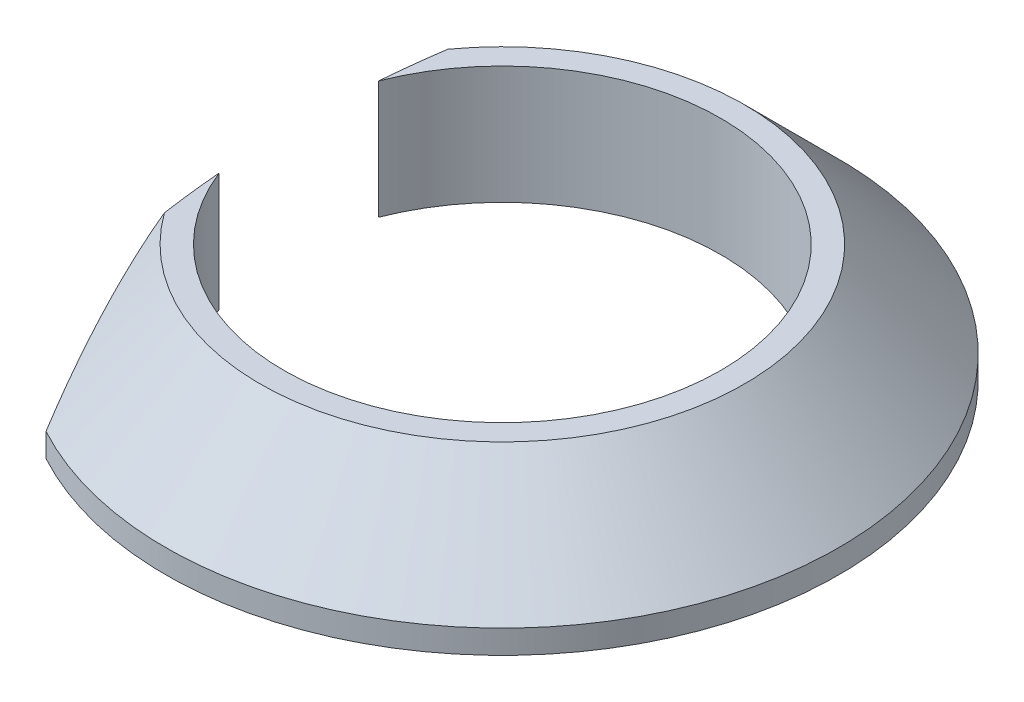
ISO-10303-21;
HEADER;
FILE_DESCRIPTION(('STEP AP214'),'2;1');
FILE_NAME('part.step','',(''),(''),'','','');
FILE_SCHEMA(('AUTOMOTIVE_DESIGN { 1 0 10303 214 1 1 1 1 }'));
ENDSEC;
DATA;
#1=APPLICATION_CONTEXT('core data for automotive mechanical design processes');
#2=APPLICATION_PROTOCOL_DEFINITION('international standard','automotive_design',2000,#1);
#3=PRODUCT_CONTEXT('',#1,'mechanical');
#4=PRODUCT('Part','Part','',(#3));
#5=PRODUCT_RELATED_PRODUCT_CATEGORY('part','',(#4));
#6=PRODUCT_DEFINITION_FORMATION('','',#4);
#7=PRODUCT_DEFINITION_CONTEXT('part definition',#1,'design');
#8=PRODUCT_DEFINITION('design','',#6,#7);
#9=PRODUCT_DEFINITION_SHAPE('','',#8);
#10=(LENGTH_UNIT() NAMED_UNIT(*) SI_UNIT(.MILLI.,.METRE.));
#11=(NAMED_UNIT(*) PLANE_ANGLE_UNIT() SI_UNIT($,.RADIAN.));
#12=(NAMED_UNIT(*) SI_UNIT($,.STERADIAN.) SOLID_ANGLE_UNIT());
#13=UNCERTAINTY_MEASURE_WITH_UNIT(LENGTH_MEASURE(1.E-05),#10,'distance_accuracy_value','');
#14=(GEOMETRIC_REPRESENTATION_CONTEXT(3) GLOBAL_UNCERTAINTY_ASSIGNED_CONTEXT((#13)) GLOBAL_UNIT_ASSIGNED_CONTEXT((#10,
#11,#12)) REPRESENTATION_CONTEXT('',''));
#15=CARTESIAN_POINT('',(0.,0.,0.));
#16=DIRECTION('',(0.,0.,1.));
#17=DIRECTION('',(1.,0.,0.));
#18=AXIS2_PLACEMENT_3D('',#15,#16,#17);
#19=CARTESIAN_POINT('',(-82.55,12.7,0.));
#20=DIRECTION('',(0.,1.,0.));
#21=DIRECTION('',(0.,0.,1.));
#22=AXIS2_PLACEMENT_3D('',#19,#20,#21);
#23=PLANE('',#22);
#24=CARTESIAN_POINT('',(0.,12.7,0.));
#25=DIRECTION('',(0.,1.,0.));
#26=DIRECTION('',(0.,0.,1.));
#27=AXIS2_PLACEMENT_3D('',#24,#25,#26);
#28=CIRCLE('',#27,104.775);
#29=CARTESIAN_POINT('',(-103.661311123816,12.7000104108605,15.2359278216531));
#30=VERTEX_POINT('',#29);
#31=CARTESIAN_POINT('',(-104.423307692308,12.7,8.57749588152816));
#32=VERTEX_POINT('',#31);
#33=EDGE_CURVE('E207',#30,#32,#28,.F.);
#34=ORIENTED_EDGE('',*,*,#33,.F.);
#35=CARTESIAN_POINT('',(-82.55,12.7,0.));
#36=DIRECTION('',(0.,1.,0.));
#37=DIRECTION('',(0.,0.,1.));
#38=AXIS2_PLACEMENT_3D('',#35,#36,#37);
#39=CIRCLE('',#38,26.035);
#40=CARTESIAN_POINT('',(-103.661311123816,12.7000104108605,-15.2359278216532));
#41=VERTEX_POINT('',#40);
#42=EDGE_CURVE('E121',#30,#41,#39,.T.);
#43=ORIENTED_EDGE('',*,*,#42,.T.);
#44=CARTESIAN_POINT('',(-104.423307692308,12.7,-8.57749588152816));
#45=VERTEX_POINT('',#44);
#46=EDGE_CURVE('E62',#45,#41,#28,.F.);
#47=ORIENTED_EDGE('',*,*,#46,.F.);
#48=CARTESIAN_POINT('',(-82.55,12.7,0.));
#49=DIRECTION('',(0.,1.,0.));
#50=DIRECTION('',(0.,0.,1.));
#51=AXIS2_PLACEMENT_3D('',#48,#49,#50);
#52=CIRCLE('',#51,23.495);
#53=EDGE_CURVE('E119',#32,#45,#52,.T.);
#54=ORIENTED_EDGE('',*,*,#53,.F.);
#55=EDGE_LOOP('',(#34,#43,#47,#54));
#56=FACE_BOUND('',#55,.T.);
#57=ADVANCED_FACE('F39',(#56),#23,.T.);
#58=CARTESIAN_POINT('',(-82.55,0.,0.));
#59=DIRECTION('',(0.,1.,0.));
#60=DIRECTION('',(0.,0.,1.));
#61=AXIS2_PLACEMENT_3D('',#58,#59,#60);
#62=PLANE('',#61);
#63=CARTESIAN_POINT('',(-82.55,0.,0.));
#64=DIRECTION('',(0.,1.,0.));
#65=DIRECTION('',(0.,0.,1.));
#66=AXIS2_PLACEMENT_3D('',#63,#64,#65);
#67=CIRCLE('',#66,36.1950000000001);
#68=CARTESIAN_POINT('',(-99.8317692307692,0.,31.802806122329));
#69=VERTEX_POINT('',#68);
#70=CARTESIAN_POINT('',(-99.8317692307692,0.,-31.802806122329));
#71=VERTEX_POINT('',#70);
#72=EDGE_CURVE('E107',#69,#71,#67,.T.);
#73=ORIENTED_EDGE('',*,*,#72,.F.);
#74=CARTESIAN_POINT('',(0.,0.,0.));
#75=DIRECTION('',(0.,-1.,0.));
#76=DIRECTION('',(0.,0.,1.));
#77=AXIS2_PLACEMENT_3D('',#74,#75,#76);
#78=CIRCLE('',#77,104.775);
#79=CARTESIAN_POINT('',(-104.423307692308,0.,8.57749588152809));
#80=VERTEX_POINT('',#79);
#81=EDGE_CURVE('E91',#69,#80,#78,.T.);
#82=ORIENTED_EDGE('',*,*,#81,.T.);
#83=CARTESIAN_POINT('',(-82.55,0.,0.));
#84=DIRECTION('',(0.,1.,0.));
#85=DIRECTION('',(0.,0.,1.));
#86=AXIS2_PLACEMENT_3D('',#83,#84,#85);
#87=CIRCLE('',#86,23.495);
#88=CARTESIAN_POINT('',(-104.423307692308,0.,-8.57749588152809));
#89=VERTEX_POINT('',#88);
#90=EDGE_CURVE('E115',#80,#89,#87,.T.);
#91=ORIENTED_EDGE('',*,*,#90,.T.);
#92=EDGE_CURVE('E100',#89,#71,#78,.T.);
#93=ORIENTED_EDGE('',*,*,#92,.T.);
#94=EDGE_LOOP('',(#73,#82,#91,#93));
#95=FACE_BOUND('',#94,.T.);
#96=ADVANCED_FACE('F41',(#95),#62,.F.);
#97=CARTESIAN_POINT('',(-82.55,12.7,0.));
#98=DIRECTION('',(0.,-1.,0.));
#99=DIRECTION('',(0.,0.,-1.));
#100=AXIS2_PLACEMENT_3D('',#97,#98,#99);
#101=CYLINDRICAL_SURFACE('',#100,23.495);
#102=DIRECTION('',(0.,1.,0.));
#103=VECTOR('',#102,1.);
#104=CARTESIAN_POINT('',(-104.423307692308,6.350006,8.57749588152816));
#105=LINE('',#104,#103);
#106=EDGE_CURVE('E94',#32,#80,#105,.F.);
#107=ORIENTED_EDGE('',*,*,#106,.F.);
#108=ORIENTED_EDGE('',*,*,#53,.T.);
#109=DIRECTION('',(0.,1.,0.));
#110=VECTOR('',#109,1.);
#111=CARTESIAN_POINT('',(-104.423307692308,6.350006,-8.57749588152816));
#112=LINE('',#111,#110);
#113=EDGE_CURVE('E210',#89,#45,#112,.T.);
#114=ORIENTED_EDGE('',*,*,#113,.F.);
#115=ORIENTED_EDGE('',*,*,#90,.F.);
#116=EDGE_LOOP('',(#107,#108,#114,#115));
#117=FACE_BOUND('',#116,.T.);
#118=ADVANCED_FACE('F157',(#117),#101,.F.);
#119=CARTESIAN_POINT('',(-82.55,12.7,0.));
#120=DIRECTION('',(0.,1.,0.));
#121=DIRECTION('',(0.,0.,1.));
#122=AXIS2_PLACEMENT_3D('',#119,#120,#121);
#123=CYLINDRICAL_SURFACE('',#122,36.1950000000001);
#124=DIRECTION('',(0.,1.,0.));
#125=VECTOR('',#124,1.);
#126=CARTESIAN_POINT('',(-99.8317692307692,0.,-31.802806122329));
#127=LINE('',#126,#125);
#128=CARTESIAN_POINT('',(-99.8317692307692,2.53999999999999,-31.802806122329));
#129=VERTEX_POINT('',#128);
#130=EDGE_CURVE('E111',#71,#129,#127,.T.);
#131=ORIENTED_EDGE('',*,*,#130,.T.);
#132=CARTESIAN_POINT('',(-82.55,2.54,0.));
#133=DIRECTION('',(0.,1.,0.));
#134=DIRECTION('',(0.,0.,1.));
#135=AXIS2_PLACEMENT_3D('',#132,#133,#134);
#136=CIRCLE('',#135,36.1950000000001);
#137=CARTESIAN_POINT('',(-99.8317692307692,2.54,31.802806122329));
#138=VERTEX_POINT('',#137);
#139=EDGE_CURVE('E109',#138,#129,#136,.T.);
#140=ORIENTED_EDGE('',*,*,#139,.F.);
#141=DIRECTION('',(0.,1.,0.));
#142=VECTOR('',#141,1.);
#143=CARTESIAN_POINT('',(-99.8317692307692,0.,31.802806122329));
#144=LINE('',#143,#142);
#145=EDGE_CURVE('E69',#69,#138,#144,.T.);
#146=ORIENTED_EDGE('',*,*,#145,.F.);
#147=ORIENTED_EDGE('',*,*,#72,.T.);
#148=EDGE_LOOP('',(#131,#140,#146,#147));
#149=FACE_BOUND('',#148,.T.);
#150=ADVANCED_FACE('F106',(#149),#123,.T.);
#151=CARTESIAN_POINT('',(-82.55,12.7,0.));
#152=DIRECTION('',(0.,-1.,0.));
#153=DIRECTION('',(0.,0.,-1.));
#154=AXIS2_PLACEMENT_3D('',#151,#152,#153);
#155=CONICAL_SURFACE('',#154,26.035,0.785398163397453);
#156=CARTESIAN_POINT('',(-99.8317055177518,2.53985468990103,31.803006122329));
#157=CARTESIAN_POINT('',(-99.9349829214848,2.77539736456259,31.4788100567588));
#158=CARTESIAN_POINT('',(-100.036865862398,3.01006186057712,31.1535343633841));
#159=CARTESIAN_POINT('',(-100.237825880864,3.47748054337146,30.5007464867124));
#160=CARTESIAN_POINT('',(-100.336902931009,3.71023471147513,30.1732342816074));
#161=CARTESIAN_POINT('',(-100.629906056799,4.40541575099968,29.1872056007529));
#162=CARTESIAN_POINT('',(-100.819594371921,4.86473893149476,28.5252275965493));
#163=CARTESIAN_POINT('',(-101.186936311339,5.77221482484589,27.193387474791));
#164=CARTESIAN_POINT('',(-101.364624009068,6.22039666514993,26.5235546162181));
#165=CARTESIAN_POINT('',(-101.708367316642,7.10515100843514,25.1732798520321));
#166=CARTESIAN_POINT('',(-101.874422701073,7.5417232863411,24.492837741142));
#167=CARTESIAN_POINT('',(-102.194837715311,8.40151253184083,23.1195498699603));
#168=CARTESIAN_POINT('',(-102.349181788962,8.82471131483218,22.4266890726039));
#169=CARTESIAN_POINT('',(-102.645588128575,9.65427688407768,21.0284234754147));
#170=CARTESIAN_POINT('',(-102.787651713216,10.0606454751084,20.3230200322415));
#171=CARTESIAN_POINT('',(-102.991422444502,10.6554908028787,19.2535628911885));
#172=CARTESIAN_POINT('',(-103.057883462654,10.8516010039805,18.8946447775441));
#173=CARTESIAN_POINT('',(-103.187547988049,11.2381585218303,18.1731917618849));
#174=CARTESIAN_POINT('',(-103.250751561299,11.4286059532938,17.8106569333359));
#175=CARTESIAN_POINT('',(-103.373854313378,11.8033295516539,17.081673845316));
#176=CARTESIAN_POINT('',(-103.433752236935,11.9876033639126,16.7152241614302));
#177=CARTESIAN_POINT('',(-103.550139773816,12.3492491849307,15.9783676888802));
#178=CARTESIAN_POINT('',(-103.606629139288,12.5266206914559,15.6079606147534));
#179=CARTESIAN_POINT('',(-103.661370768989,12.7002,15.2355123082323));
#180=B_SPLINE_CURVE_WITH_KNOTS('',3,(#156,#157,#158,#159,#160,#161,#162,#163,#164,#165,#166,
#167,#168,#169,#170,#171,#172,#173,#174,#175,#176,#177,#178,#179),.UNSPECIFIED.,.F.,.F.,(4,2,2,
2,2,2,2,2,2,2,2,4),(0.,1.24146015823602,2.48293243907722,4.96599399143478,7.44168002654344,
9.91741402296736,12.3963809750902,14.8750814045748,16.1181216641101,17.3611367251621,
18.6046206003254,19.8481947868546),.UNSPECIFIED.);
#181=EDGE_CURVE('E11',#138,#30,#180,.T.);
#182=ORIENTED_EDGE('',*,*,#181,.F.);
#183=ORIENTED_EDGE('',*,*,#139,.T.);
#184=CARTESIAN_POINT('',(-103.661370768989,12.7002,-15.2355123082323));
#185=CARTESIAN_POINT('',(-103.606629139288,12.5266206914559,-15.6079606147534));
#186=CARTESIAN_POINT('',(-103.550139773816,12.3492491849307,-15.9783676888802));
#187=CARTESIAN_POINT('',(-103.433752236935,11.9876033639126,-16.7152241614302));
#188=CARTESIAN_POINT('',(-103.373854313378,11.8033295516539,-17.081673845316));
#189=CARTESIAN_POINT('',(-103.250751561299,11.4286059532938,-17.8106569333359));
#190=CARTESIAN_POINT('',(-103.187547988049,11.2381585218303,-18.1731917618849));
#191=CARTESIAN_POINT('',(-103.057883462654,10.8516010039805,-18.8946447775441));
#192=CARTESIAN_POINT('',(-102.991422444502,10.6554908028787,-19.2535628911885));
#193=CARTESIAN_POINT('',(-102.787651713216,10.0606454751084,-20.3230200322415));
#194=CARTESIAN_POINT('',(-102.645588128575,9.65427688407767,-21.0284234754148));
#195=CARTESIAN_POINT('',(-102.349181788962,8.82471131483218,-22.426689072604));
#196=CARTESIAN_POINT('',(-102.194837715311,8.40151253184082,-23.1195498699603));
#197=CARTESIAN_POINT('',(-101.874422701073,7.54172328634109,-24.492837741142));
#198=CARTESIAN_POINT('',(-101.708367316642,7.10515100843512,-25.1732798520322));
#199=CARTESIAN_POINT('',(-101.364624009068,6.22039666514991,-26.5235546162182));
#200=CARTESIAN_POINT('',(-101.186936311339,5.77221482484588,-27.1933874747911));
#201=CARTESIAN_POINT('',(-100.819594371921,4.86473893149474,-28.5252275965493));
#202=CARTESIAN_POINT('',(-100.629906056799,4.40541575099966,-29.1872056007529));
#203=CARTESIAN_POINT('',(-100.336902931009,3.71023471147511,-30.1732342816075));
#204=CARTESIAN_POINT('',(-100.237825880864,3.47748054337144,-30.5007464867124));
#205=CARTESIAN_POINT('',(-100.036865862398,3.0100618605771,-31.1535343633842));
#206=CARTESIAN_POINT('',(-99.9349829214848,2.77539736456257,-31.4788100567588));
#207=CARTESIAN_POINT('',(-99.8317055177518,2.53985468990101,-31.803006122329));
#208=B_SPLINE_CURVE_WITH_KNOTS('',3,(#184,#185,#186,#187,#188,#189,#190,#191,#192,#193,#194,
#195,#196,#197,#198,#199,#200,#201,#202,#203,#204,#205,#206,#207),.UNSPECIFIED.,.F.,.F.,(4,2,2,
2,2,2,2,2,2,2,2,4),(0.,1.24357418652921,2.48705806169257,3.73007312274454,4.9731133822798,
7.45181381176446,9.93078076388729,12.4065147603112,14.8822007954199,17.3652623477774,
18.6067346286186,19.8481947868547),.UNSPECIFIED.);
#209=EDGE_CURVE('E55',#41,#129,#208,.T.);
#210=ORIENTED_EDGE('',*,*,#209,.F.);
#211=ORIENTED_EDGE('',*,*,#42,.F.);
#212=EDGE_LOOP('',(#182,#183,#210,#211));
#213=FACE_BOUND('',#212,.T.);
#214=ADVANCED_FACE('F140',(#213),#155,.T.);
#215=CARTESIAN_POINT('',(0.,0.,0.));
#216=DIRECTION('',(0.,1.,0.));
#217=DIRECTION('',(0.,0.,1.));
#218=AXIS2_PLACEMENT_3D('',#215,#216,#217);
#219=CYLINDRICAL_SURFACE('',#218,104.775);
#220=ORIENTED_EDGE('',*,*,#113,.T.);
#221=ORIENTED_EDGE('',*,*,#46,.T.);
#222=ORIENTED_EDGE('',*,*,#209,.T.);
#223=ORIENTED_EDGE('',*,*,#130,.F.);
#224=ORIENTED_EDGE('',*,*,#92,.F.);
#225=EDGE_LOOP('',(#220,#221,#222,#223,#224));
#226=FACE_BOUND('',#225,.T.);
#227=ADVANCED_FACE('F143',(#226),#219,.T.);
#228=ORIENTED_EDGE('',*,*,#106,.T.);
#229=ORIENTED_EDGE('',*,*,#81,.F.);
#230=ORIENTED_EDGE('',*,*,#145,.T.);
#231=ORIENTED_EDGE('',*,*,#181,.T.);
#232=ORIENTED_EDGE('',*,*,#33,.T.);
#233=EDGE_LOOP('',(#228,#229,#230,#231,#232));
#234=FACE_BOUND('',#233,.T.);
#235=ADVANCED_FACE('F92',(#234),#219,.T.);
#236=CLOSED_SHELL('',(#57,#96,#118,#150,#214,#227,#235));
#237=MANIFOLD_SOLID_BREP('B2',#236);
#238=ADVANCED_BREP_SHAPE_REPRESENTATION('',(#18,#237),#14);
#239=SHAPE_DEFINITION_REPRESENTATION(#9,#238);
ENDSEC;
END-ISO-10303-21;
